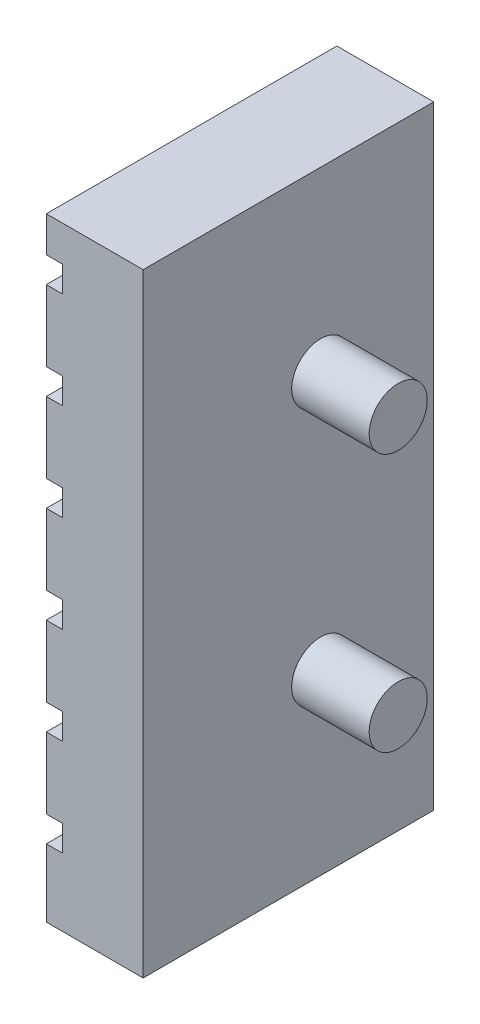
ISO-10303-21;
HEADER;
FILE_DESCRIPTION(('STEP AP214'),'2;1');
FILE_NAME('part.step','',(''),(''),'','','');
FILE_SCHEMA(('AUTOMOTIVE_DESIGN { 1 0 10303 214 1 1 1 1 }'));
ENDSEC;
DATA;
#1=APPLICATION_CONTEXT('core data for automotive mechanical design processes');
#2=APPLICATION_PROTOCOL_DEFINITION('international standard','automotive_design',2000,#1);
#3=PRODUCT_CONTEXT('',#1,'mechanical');
#4=PRODUCT('Part','Part','',(#3));
#5=PRODUCT_RELATED_PRODUCT_CATEGORY('part','',(#4));
#6=PRODUCT_DEFINITION_FORMATION('','',#4);
#7=PRODUCT_DEFINITION_CONTEXT('part definition',#1,'design');
#8=PRODUCT_DEFINITION('design','',#6,#7);
#9=PRODUCT_DEFINITION_SHAPE('','',#8);
#10=(LENGTH_UNIT() NAMED_UNIT(*) SI_UNIT(.MILLI.,.METRE.));
#11=(NAMED_UNIT(*) PLANE_ANGLE_UNIT() SI_UNIT($,.RADIAN.));
#12=(NAMED_UNIT(*) SI_UNIT($,.STERADIAN.) SOLID_ANGLE_UNIT());
#13=UNCERTAINTY_MEASURE_WITH_UNIT(LENGTH_MEASURE(1.E-05),#10,'distance_accuracy_value','');
#14=(GEOMETRIC_REPRESENTATION_CONTEXT(3) GLOBAL_UNCERTAINTY_ASSIGNED_CONTEXT((#13)) GLOBAL_UNIT_ASSIGNED_CONTEXT((#10,
#11,#12)) REPRESENTATION_CONTEXT('',''));
#15=CARTESIAN_POINT('',(0.,0.,0.));
#16=DIRECTION('',(0.,0.,1.));
#17=DIRECTION('',(1.,0.,0.));
#18=AXIS2_PLACEMENT_3D('',#15,#16,#17);
#19=CARTESIAN_POINT('',(-3.6,-52.,3.5));
#20=DIRECTION('',(1.,0.,0.));
#21=DIRECTION('',(0.,1.,0.));
#22=AXIS2_PLACEMENT_3D('',#19,#20,#21);
#23=PLANE('',#22);
#24=CARTESIAN_POINT('',(-3.6,-52.,3.5));
#25=DIRECTION('',(1.,0.,0.));
#26=DIRECTION('',(0.,0.,1.));
#27=AXIS2_PLACEMENT_3D('',#24,#25,#26);
#28=CIRCLE('',#27,0.9);
#29=CARTESIAN_POINT('',(-3.6,-52.,4.4));
#30=VERTEX_POINT('',#29);
#31=EDGE_CURVE('E194',#30,#30,#28,.T.);
#32=ORIENTED_EDGE('',*,*,#31,.T.);
#33=EDGE_LOOP('',(#32));
#34=FACE_BOUND('',#33,.T.);
#35=ADVANCED_FACE('F16',(#34),#23,.T.);
#36=CARTESIAN_POINT('',(-3.6,-60.,3.5));
#37=DIRECTION('',(1.,0.,0.));
#38=DIRECTION('',(0.,1.,0.));
#39=AXIS2_PLACEMENT_3D('',#36,#37,#38);
#40=PLANE('',#39);
#41=CARTESIAN_POINT('',(-3.6,-60.,3.5));
#42=DIRECTION('',(1.,0.,0.));
#43=DIRECTION('',(0.,0.,1.));
#44=AXIS2_PLACEMENT_3D('',#41,#42,#43);
#45=CIRCLE('',#44,0.9);
#46=CARTESIAN_POINT('',(-3.6,-60.,4.4));
#47=VERTEX_POINT('',#46);
#48=EDGE_CURVE('E195',#47,#47,#45,.T.);
#49=ORIENTED_EDGE('',*,*,#48,.T.);
#50=EDGE_LOOP('',(#49));
#51=FACE_BOUND('',#50,.T.);
#52=ADVANCED_FACE('F18',(#51),#40,.T.);
#53=CARTESIAN_POINT('',(-9.,-46.5,0.));
#54=DIRECTION('',(1.,0.,0.));
#55=DIRECTION('',(0.,1.,0.));
#56=AXIS2_PLACEMENT_3D('',#53,#54,#55);
#57=PLANE('',#56);
#58=DIRECTION('',(0.,0.,1.));
#59=VECTOR('',#58,1.);
#60=CARTESIAN_POINT('',(-9.,-47.6,-0.5));
#61=LINE('',#60,#59);
#62=CARTESIAN_POINT('',(-9.,-47.6,0.));
#63=VERTEX_POINT('',#62);
#64=CARTESIAN_POINT('',(-9.,-47.6,9.));
#65=VERTEX_POINT('',#64);
#66=EDGE_CURVE('E10',#63,#65,#61,.T.);
#67=ORIENTED_EDGE('',*,*,#66,.T.);
#68=DIRECTION('',(0.,-1.,0.));
#69=VECTOR('',#68,1.);
#70=CARTESIAN_POINT('',(-9.,-46.5,9.));
#71=LINE('',#70,#69);
#72=CARTESIAN_POINT('',(-9.,-46.5,9.));
#73=VERTEX_POINT('',#72);
#74=EDGE_CURVE('E281',#73,#65,#71,.T.);
#75=ORIENTED_EDGE('',*,*,#74,.F.);
#76=DIRECTION('',(0.,0.,1.));
#77=VECTOR('',#76,1.);
#78=CARTESIAN_POINT('',(-9.,-46.5,0.));
#79=LINE('',#78,#77);
#80=CARTESIAN_POINT('',(-9.,-46.5,0.));
#81=VERTEX_POINT('',#80);
#82=EDGE_CURVE('E199',#81,#73,#79,.T.);
#83=ORIENTED_EDGE('',*,*,#82,.F.);
#84=DIRECTION('',(0.,-1.,0.));
#85=VECTOR('',#84,1.);
#86=CARTESIAN_POINT('',(-9.,-46.5,0.));
#87=LINE('',#86,#85);
#88=EDGE_CURVE('E312',#81,#63,#87,.T.);
#89=ORIENTED_EDGE('',*,*,#88,.T.);
#90=EDGE_LOOP('',(#67,#75,#83,#89));
#91=FACE_BOUND('',#90,.T.);
#92=ADVANCED_FACE('F707',(#91),#57,.F.);
#93=CARTESIAN_POINT('',(-9.5,-47.6,-1.));
#94=DIRECTION('',(0.,1.,0.));
#95=DIRECTION('',(1.,0.,0.));
#96=AXIS2_PLACEMENT_3D('',#93,#94,#95);
#97=PLANE('',#96);
#98=DIRECTION('',(-1.,0.,0.));
#99=VECTOR('',#98,1.);
#100=CARTESIAN_POINT('',(-8.5,-47.6,9.));
#101=LINE('',#100,#99);
#102=CARTESIAN_POINT('',(-8.5,-47.6,9.));
#103=VERTEX_POINT('',#102);
#104=EDGE_CURVE('E279',#103,#65,#101,.T.);
#105=ORIENTED_EDGE('',*,*,#104,.T.);
#106=ORIENTED_EDGE('',*,*,#66,.F.);
#107=DIRECTION('',(-1.,0.,0.));
#108=VECTOR('',#107,1.);
#109=CARTESIAN_POINT('',(-8.5,-47.6,0.));
#110=LINE('',#109,#108);
#111=CARTESIAN_POINT('',(-8.5,-47.6,0.));
#112=VERTEX_POINT('',#111);
#113=EDGE_CURVE('E317',#112,#63,#110,.T.);
#114=ORIENTED_EDGE('',*,*,#113,.F.);
#115=DIRECTION('',(0.,0.,1.));
#116=VECTOR('',#115,1.);
#117=CARTESIAN_POINT('',(-8.5,-47.6,-1.));
#118=LINE('',#117,#116);
#119=EDGE_CURVE('E27',#112,#103,#118,.T.);
#120=ORIENTED_EDGE('',*,*,#119,.T.);
#121=EDGE_LOOP('',(#105,#106,#114,#120));
#122=FACE_BOUND('',#121,.T.);
#123=ADVANCED_FACE('F717',(#122),#97,.F.);
#124=CARTESIAN_POINT('',(-8.5,-48.4,-1.));
#125=DIRECTION('',(1.,0.,0.));
#126=DIRECTION('',(0.,1.,0.));
#127=AXIS2_PLACEMENT_3D('',#124,#125,#126);
#128=PLANE('',#127);
#129=DIRECTION('',(0.,1.,0.));
#130=VECTOR('',#129,1.);
#131=CARTESIAN_POINT('',(-8.5,-52.2,9.));
#132=LINE('',#131,#130);
#133=CARTESIAN_POINT('',(-8.5,-48.4,9.));
#134=VERTEX_POINT('',#133);
#135=EDGE_CURVE('E276',#134,#103,#132,.T.);
#136=ORIENTED_EDGE('',*,*,#135,.T.);
#137=ORIENTED_EDGE('',*,*,#119,.F.);
#138=DIRECTION('',(0.,1.,0.));
#139=VECTOR('',#138,1.);
#140=CARTESIAN_POINT('',(-8.5,-52.2,0.));
#141=LINE('',#140,#139);
#142=CARTESIAN_POINT('',(-8.5,-48.4,0.));
#143=VERTEX_POINT('',#142);
#144=EDGE_CURVE('E321',#143,#112,#141,.T.);
#145=ORIENTED_EDGE('',*,*,#144,.F.);
#146=DIRECTION('',(0.,0.,1.));
#147=VECTOR('',#146,1.);
#148=CARTESIAN_POINT('',(-8.5,-48.4,-1.));
#149=LINE('',#148,#147);
#150=EDGE_CURVE('E20',#143,#134,#149,.T.);
#151=ORIENTED_EDGE('',*,*,#150,.T.);
#152=EDGE_LOOP('',(#136,#137,#145,#151));
#153=FACE_BOUND('',#152,.T.);
#154=ADVANCED_FACE('F725',(#153),#128,.F.);
#155=CARTESIAN_POINT('',(-9.5,-48.4,-1.));
#156=DIRECTION('',(0.,1.,0.));
#157=DIRECTION('',(1.,0.,0.));
#158=AXIS2_PLACEMENT_3D('',#155,#156,#157);
#159=PLANE('',#158);
#160=ORIENTED_EDGE('',*,*,#150,.F.);
#161=DIRECTION('',(-1.,0.,0.));
#162=VECTOR('',#161,1.);
#163=CARTESIAN_POINT('',(-8.5,-48.4,0.));
#164=LINE('',#163,#162);
#165=CARTESIAN_POINT('',(-9.,-48.4,0.));
#166=VERTEX_POINT('',#165);
#167=EDGE_CURVE('E325',#143,#166,#164,.T.);
#168=ORIENTED_EDGE('',*,*,#167,.T.);
#169=DIRECTION('',(0.,0.,1.));
#170=VECTOR('',#169,1.);
#171=CARTESIAN_POINT('',(-9.,-48.4,-0.5));
#172=LINE('',#171,#170);
#173=CARTESIAN_POINT('',(-9.,-48.4,9.));
#174=VERTEX_POINT('',#173);
#175=EDGE_CURVE('E187',#166,#174,#172,.T.);
#176=ORIENTED_EDGE('',*,*,#175,.T.);
#177=DIRECTION('',(-1.,0.,0.));
#178=VECTOR('',#177,1.);
#179=CARTESIAN_POINT('',(-8.5,-48.4,9.));
#180=LINE('',#179,#178);
#181=EDGE_CURVE('E271',#134,#174,#180,.T.);
#182=ORIENTED_EDGE('',*,*,#181,.F.);
#183=EDGE_LOOP('',(#160,#168,#176,#182));
#184=FACE_BOUND('',#183,.T.);
#185=ADVANCED_FACE('F734',(#184),#159,.T.);
#186=CARTESIAN_POINT('',(-9.,-46.5,0.));
#187=DIRECTION('',(1.,0.,0.));
#188=DIRECTION('',(0.,1.,0.));
#189=AXIS2_PLACEMENT_3D('',#186,#187,#188);
#190=PLANE('',#189);
#191=DIRECTION('',(0.,0.,1.));
#192=VECTOR('',#191,1.);
#193=CARTESIAN_POINT('',(-9.,-50.6,-0.5));
#194=LINE('',#193,#192);
#195=CARTESIAN_POINT('',(-9.,-50.6,0.));
#196=VERTEX_POINT('',#195);
#197=CARTESIAN_POINT('',(-9.,-50.6,9.));
#198=VERTEX_POINT('',#197);
#199=EDGE_CURVE('E189',#196,#198,#194,.T.);
#200=ORIENTED_EDGE('',*,*,#199,.T.);
#201=DIRECTION('',(0.,-1.,0.));
#202=VECTOR('',#201,1.);
#203=CARTESIAN_POINT('',(-9.,-46.5,9.));
#204=LINE('',#203,#202);
#205=EDGE_CURVE('E253',#174,#198,#204,.T.);
#206=ORIENTED_EDGE('',*,*,#205,.F.);
#207=ORIENTED_EDGE('',*,*,#175,.F.);
#208=DIRECTION('',(0.,-1.,0.));
#209=VECTOR('',#208,1.);
#210=CARTESIAN_POINT('',(-9.,-46.5,0.));
#211=LINE('',#210,#209);
#212=EDGE_CURVE('E257',#166,#196,#211,.T.);
#213=ORIENTED_EDGE('',*,*,#212,.T.);
#214=EDGE_LOOP('',(#200,#206,#207,#213));
#215=FACE_BOUND('',#214,.T.);
#216=ADVANCED_FACE('F250',(#215),#190,.F.);
#217=CARTESIAN_POINT('',(-9.5,-50.6,-1.));
#218=DIRECTION('',(0.,1.,0.));
#219=DIRECTION('',(1.,0.,0.));
#220=AXIS2_PLACEMENT_3D('',#217,#218,#219);
#221=PLANE('',#220);
#222=DIRECTION('',(-1.,0.,0.));
#223=VECTOR('',#222,1.);
#224=CARTESIAN_POINT('',(-8.5,-50.6,9.));
#225=LINE('',#224,#223);
#226=CARTESIAN_POINT('',(-8.5,-50.6,9.));
#227=VERTEX_POINT('',#226);
#228=EDGE_CURVE('E262',#227,#198,#225,.T.);
#229=ORIENTED_EDGE('',*,*,#228,.T.);
#230=ORIENTED_EDGE('',*,*,#199,.F.);
#231=DIRECTION('',(-1.,0.,0.));
#232=VECTOR('',#231,1.);
#233=CARTESIAN_POINT('',(-8.5,-50.6,0.));
#234=LINE('',#233,#232);
#235=CARTESIAN_POINT('',(-8.5,-50.6,0.));
#236=VERTEX_POINT('',#235);
#237=EDGE_CURVE('E337',#236,#196,#234,.T.);
#238=ORIENTED_EDGE('',*,*,#237,.F.);
#239=DIRECTION('',(0.,0.,1.));
#240=VECTOR('',#239,1.);
#241=CARTESIAN_POINT('',(-8.5,-50.6,-1.));
#242=LINE('',#241,#240);
#243=EDGE_CURVE('E209',#236,#227,#242,.T.);
#244=ORIENTED_EDGE('',*,*,#243,.T.);
#245=EDGE_LOOP('',(#229,#230,#238,#244));
#246=FACE_BOUND('',#245,.T.);
#247=ADVANCED_FACE('F263',(#246),#221,.F.);
#248=CARTESIAN_POINT('',(-8.5,-51.4,-1.));
#249=DIRECTION('',(1.,0.,0.));
#250=DIRECTION('',(0.,1.,0.));
#251=AXIS2_PLACEMENT_3D('',#248,#249,#250);
#252=PLANE('',#251);
#253=DIRECTION('',(0.,1.,0.));
#254=VECTOR('',#253,1.);
#255=CARTESIAN_POINT('',(-8.5,-53.7,9.));
#256=LINE('',#255,#254);
#257=CARTESIAN_POINT('',(-8.5,-51.4,9.));
#258=VERTEX_POINT('',#257);
#259=EDGE_CURVE('E155',#258,#227,#256,.T.);
#260=ORIENTED_EDGE('',*,*,#259,.T.);
#261=ORIENTED_EDGE('',*,*,#243,.F.);
#262=DIRECTION('',(0.,1.,0.));
#263=VECTOR('',#262,1.);
#264=CARTESIAN_POINT('',(-8.5,-53.7,0.));
#265=LINE('',#264,#263);
#266=CARTESIAN_POINT('',(-8.5,-51.4,0.));
#267=VERTEX_POINT('',#266);
#268=EDGE_CURVE('E340',#267,#236,#265,.T.);
#269=ORIENTED_EDGE('',*,*,#268,.F.);
#270=DIRECTION('',(0.,0.,1.));
#271=VECTOR('',#270,1.);
#272=CARTESIAN_POINT('',(-8.5,-51.4,-1.));
#273=LINE('',#272,#271);
#274=EDGE_CURVE('E212',#267,#258,#273,.T.);
#275=ORIENTED_EDGE('',*,*,#274,.T.);
#276=EDGE_LOOP('',(#260,#261,#269,#275));
#277=FACE_BOUND('',#276,.T.);
#278=ADVANCED_FACE('F762',(#277),#252,.F.);
#279=CARTESIAN_POINT('',(-9.5,-51.4,-1.));
#280=DIRECTION('',(0.,1.,0.));
#281=DIRECTION('',(1.,0.,0.));
#282=AXIS2_PLACEMENT_3D('',#279,#280,#281);
#283=PLANE('',#282);
#284=ORIENTED_EDGE('',*,*,#274,.F.);
#285=DIRECTION('',(-1.,0.,0.));
#286=VECTOR('',#285,1.);
#287=CARTESIAN_POINT('',(-8.5,-51.4,0.));
#288=LINE('',#287,#286);
#289=CARTESIAN_POINT('',(-9.,-51.4,0.));
#290=VERTEX_POINT('',#289);
#291=EDGE_CURVE('E347',#267,#290,#288,.T.);
#292=ORIENTED_EDGE('',*,*,#291,.T.);
#293=DIRECTION('',(0.,0.,1.));
#294=VECTOR('',#293,1.);
#295=CARTESIAN_POINT('',(-9.,-51.4,-0.5));
#296=LINE('',#295,#294);
#297=CARTESIAN_POINT('',(-9.,-51.4,9.));
#298=VERTEX_POINT('',#297);
#299=EDGE_CURVE('E237',#290,#298,#296,.T.);
#300=ORIENTED_EDGE('',*,*,#299,.T.);
#301=DIRECTION('',(-1.,0.,0.));
#302=VECTOR('',#301,1.);
#303=CARTESIAN_POINT('',(-8.5,-51.4,9.));
#304=LINE('',#303,#302);
#305=EDGE_CURVE('E157',#258,#298,#304,.T.);
#306=ORIENTED_EDGE('',*,*,#305,.F.);
#307=EDGE_LOOP('',(#284,#292,#300,#306));
#308=FACE_BOUND('',#307,.T.);
#309=ADVANCED_FACE('F767',(#308),#283,.T.);
#310=CARTESIAN_POINT('',(-9.,-46.5,0.));
#311=DIRECTION('',(1.,0.,0.));
#312=DIRECTION('',(0.,1.,0.));
#313=AXIS2_PLACEMENT_3D('',#310,#311,#312);
#314=PLANE('',#313);
#315=DIRECTION('',(0.,0.,1.));
#316=VECTOR('',#315,1.);
#317=CARTESIAN_POINT('',(-9.,-53.6,-0.5));
#318=LINE('',#317,#316);
#319=CARTESIAN_POINT('',(-9.,-53.6,0.));
#320=VERTEX_POINT('',#319);
#321=CARTESIAN_POINT('',(-9.,-53.6,9.));
#322=VERTEX_POINT('',#321);
#323=EDGE_CURVE('E233',#320,#322,#318,.T.);
#324=ORIENTED_EDGE('',*,*,#323,.T.);
#325=DIRECTION('',(0.,-1.,0.));
#326=VECTOR('',#325,1.);
#327=CARTESIAN_POINT('',(-9.,-46.5,9.));
#328=LINE('',#327,#326);
#329=EDGE_CURVE('E160',#298,#322,#328,.T.);
#330=ORIENTED_EDGE('',*,*,#329,.F.);
#331=ORIENTED_EDGE('',*,*,#299,.F.);
#332=DIRECTION('',(0.,-1.,0.));
#333=VECTOR('',#332,1.);
#334=CARTESIAN_POINT('',(-9.,-46.5,0.));
#335=LINE('',#334,#333);
#336=EDGE_CURVE('E351',#290,#320,#335,.T.);
#337=ORIENTED_EDGE('',*,*,#336,.T.);
#338=EDGE_LOOP('',(#324,#330,#331,#337));
#339=FACE_BOUND('',#338,.T.);
#340=ADVANCED_FACE('F486',(#339),#314,.F.);
#341=CARTESIAN_POINT('',(-9.5,-53.6,-1.));
#342=DIRECTION('',(0.,1.,0.));
#343=DIRECTION('',(1.,0.,0.));
#344=AXIS2_PLACEMENT_3D('',#341,#342,#343);
#345=PLANE('',#344);
#346=DIRECTION('',(-1.,0.,0.));
#347=VECTOR('',#346,1.);
#348=CARTESIAN_POINT('',(-8.5,-53.6,9.));
#349=LINE('',#348,#347);
#350=CARTESIAN_POINT('',(-8.5,-53.6,9.));
#351=VERTEX_POINT('',#350);
#352=EDGE_CURVE('E161',#351,#322,#349,.T.);
#353=ORIENTED_EDGE('',*,*,#352,.T.);
#354=ORIENTED_EDGE('',*,*,#323,.F.);
#355=DIRECTION('',(-1.,0.,0.));
#356=VECTOR('',#355,1.);
#357=CARTESIAN_POINT('',(-8.5,-53.6,0.));
#358=LINE('',#357,#356);
#359=CARTESIAN_POINT('',(-8.5,-53.6,0.));
#360=VERTEX_POINT('',#359);
#361=EDGE_CURVE('E355',#360,#320,#358,.T.);
#362=ORIENTED_EDGE('',*,*,#361,.F.);
#363=DIRECTION('',(0.,0.,1.));
#364=VECTOR('',#363,1.);
#365=CARTESIAN_POINT('',(-8.5,-53.6,-1.));
#366=LINE('',#365,#364);
#367=EDGE_CURVE('E226',#360,#351,#366,.T.);
#368=ORIENTED_EDGE('',*,*,#367,.T.);
#369=EDGE_LOOP('',(#353,#354,#362,#368));
#370=FACE_BOUND('',#369,.T.);
#371=ADVANCED_FACE('F493',(#370),#345,.F.);
#372=CARTESIAN_POINT('',(-8.5,-54.4,-1.));
#373=DIRECTION('',(1.,0.,0.));
#374=DIRECTION('',(0.,1.,0.));
#375=AXIS2_PLACEMENT_3D('',#372,#373,#374);
#376=PLANE('',#375);
#377=DIRECTION('',(0.,1.,0.));
#378=VECTOR('',#377,1.);
#379=CARTESIAN_POINT('',(-8.5,-55.2,9.));
#380=LINE('',#379,#378);
#381=CARTESIAN_POINT('',(-8.5,-54.4,9.));
#382=VERTEX_POINT('',#381);
#383=EDGE_CURVE('E165',#382,#351,#380,.T.);
#384=ORIENTED_EDGE('',*,*,#383,.T.);
#385=ORIENTED_EDGE('',*,*,#367,.F.);
#386=DIRECTION('',(0.,1.,0.));
#387=VECTOR('',#386,1.);
#388=CARTESIAN_POINT('',(-8.5,-55.2,0.));
#389=LINE('',#388,#387);
#390=CARTESIAN_POINT('',(-8.5,-54.4,0.));
#391=VERTEX_POINT('',#390);
#392=EDGE_CURVE('E359',#391,#360,#389,.T.);
#393=ORIENTED_EDGE('',*,*,#392,.F.);
#394=DIRECTION('',(0.,0.,1.));
#395=VECTOR('',#394,1.);
#396=CARTESIAN_POINT('',(-8.5,-54.4,-1.));
#397=LINE('',#396,#395);
#398=EDGE_CURVE('E223',#391,#382,#397,.T.);
#399=ORIENTED_EDGE('',*,*,#398,.T.);
#400=EDGE_LOOP('',(#384,#385,#393,#399));
#401=FACE_BOUND('',#400,.T.);
#402=ADVANCED_FACE('F500',(#401),#376,.F.);
#403=CARTESIAN_POINT('',(-9.5,-54.4,-1.));
#404=DIRECTION('',(0.,1.,0.));
#405=DIRECTION('',(1.,0.,0.));
#406=AXIS2_PLACEMENT_3D('',#403,#404,#405);
#407=PLANE('',#406);
#408=ORIENTED_EDGE('',*,*,#398,.F.);
#409=DIRECTION('',(-1.,0.,0.));
#410=VECTOR('',#409,1.);
#411=CARTESIAN_POINT('',(-8.5,-54.4,0.));
#412=LINE('',#411,#410);
#413=CARTESIAN_POINT('',(-9.,-54.4,0.));
#414=VERTEX_POINT('',#413);
#415=EDGE_CURVE('E363',#391,#414,#412,.T.);
#416=ORIENTED_EDGE('',*,*,#415,.T.);
#417=DIRECTION('',(0.,0.,1.));
#418=VECTOR('',#417,1.);
#419=CARTESIAN_POINT('',(-9.,-54.4,-0.5));
#420=LINE('',#419,#418);
#421=CARTESIAN_POINT('',(-9.,-54.4,9.));
#422=VERTEX_POINT('',#421);
#423=EDGE_CURVE('E227',#414,#422,#420,.T.);
#424=ORIENTED_EDGE('',*,*,#423,.T.);
#425=DIRECTION('',(-1.,0.,0.));
#426=VECTOR('',#425,1.);
#427=CARTESIAN_POINT('',(-8.5,-54.4,9.));
#428=LINE('',#427,#426);
#429=EDGE_CURVE('E169',#382,#422,#428,.T.);
#430=ORIENTED_EDGE('',*,*,#429,.F.);
#431=EDGE_LOOP('',(#408,#416,#424,#430));
#432=FACE_BOUND('',#431,.T.);
#433=ADVANCED_FACE('F508',(#432),#407,.T.);
#434=CARTESIAN_POINT('',(-9.,-46.5,0.));
#435=DIRECTION('',(1.,0.,0.));
#436=DIRECTION('',(0.,1.,0.));
#437=AXIS2_PLACEMENT_3D('',#434,#435,#436);
#438=PLANE('',#437);
#439=DIRECTION('',(0.,0.,1.));
#440=VECTOR('',#439,1.);
#441=CARTESIAN_POINT('',(-9.,-56.6,-0.5));
#442=LINE('',#441,#440);
#443=CARTESIAN_POINT('',(-9.,-56.6,0.));
#444=VERTEX_POINT('',#443);
#445=CARTESIAN_POINT('',(-9.,-56.6,9.));
#446=VERTEX_POINT('',#445);
#447=EDGE_CURVE('E299',#444,#446,#442,.T.);
#448=ORIENTED_EDGE('',*,*,#447,.T.);
#449=DIRECTION('',(0.,-1.,0.));
#450=VECTOR('',#449,1.);
#451=CARTESIAN_POINT('',(-9.,-46.5,9.));
#452=LINE('',#451,#450);
#453=EDGE_CURVE('E173',#422,#446,#452,.T.);
#454=ORIENTED_EDGE('',*,*,#453,.F.);
#455=ORIENTED_EDGE('',*,*,#423,.F.);
#456=DIRECTION('',(0.,-1.,0.));
#457=VECTOR('',#456,1.);
#458=CARTESIAN_POINT('',(-9.,-46.5,0.));
#459=LINE('',#458,#457);
#460=EDGE_CURVE('E370',#414,#444,#459,.T.);
#461=ORIENTED_EDGE('',*,*,#460,.T.);
#462=EDGE_LOOP('',(#448,#454,#455,#461));
#463=FACE_BOUND('',#462,.T.);
#464=ADVANCED_FACE('F515',(#463),#438,.F.);
#465=CARTESIAN_POINT('',(-9.5,-56.6,-1.));
#466=DIRECTION('',(0.,1.,0.));
#467=DIRECTION('',(1.,0.,0.));
#468=AXIS2_PLACEMENT_3D('',#465,#466,#467);
#469=PLANE('',#468);
#470=DIRECTION('',(-1.,0.,0.));
#471=VECTOR('',#470,1.);
#472=CARTESIAN_POINT('',(-8.5,-56.6,9.));
#473=LINE('',#472,#471);
#474=CARTESIAN_POINT('',(-8.5,-56.6,9.));
#475=VERTEX_POINT('',#474);
#476=EDGE_CURVE('E313',#475,#446,#473,.T.);
#477=ORIENTED_EDGE('',*,*,#476,.T.);
#478=ORIENTED_EDGE('',*,*,#447,.F.);
#479=DIRECTION('',(-1.,0.,0.));
#480=VECTOR('',#479,1.);
#481=CARTESIAN_POINT('',(-8.5,-56.6,0.));
#482=LINE('',#481,#480);
#483=CARTESIAN_POINT('',(-8.5,-56.6,0.));
#484=VERTEX_POINT('',#483);
#485=EDGE_CURVE('E374',#484,#444,#482,.T.);
#486=ORIENTED_EDGE('',*,*,#485,.F.);
#487=DIRECTION('',(0.,0.,1.));
#488=VECTOR('',#487,1.);
#489=CARTESIAN_POINT('',(-8.5,-56.6,-1.));
#490=LINE('',#489,#488);
#491=EDGE_CURVE('E221',#484,#475,#490,.T.);
#492=ORIENTED_EDGE('',*,*,#491,.T.);
#493=EDGE_LOOP('',(#477,#478,#486,#492));
#494=FACE_BOUND('',#493,.T.);
#495=ADVANCED_FACE('F520',(#494),#469,.F.);
#496=CARTESIAN_POINT('',(-8.5,-57.4,-1.));
#497=DIRECTION('',(1.,0.,0.));
#498=DIRECTION('',(0.,1.,0.));
#499=AXIS2_PLACEMENT_3D('',#496,#497,#498);
#500=PLANE('',#499);
#501=DIRECTION('',(0.,1.,0.));
#502=VECTOR('',#501,1.);
#503=CARTESIAN_POINT('',(-8.5,-56.7,9.));
#504=LINE('',#503,#502);
#505=CARTESIAN_POINT('',(-8.5,-57.4,9.));
#506=VERTEX_POINT('',#505);
#507=EDGE_CURVE('E179',#506,#475,#504,.T.);
#508=ORIENTED_EDGE('',*,*,#507,.T.);
#509=ORIENTED_EDGE('',*,*,#491,.F.);
#510=DIRECTION('',(0.,1.,0.));
#511=VECTOR('',#510,1.);
#512=CARTESIAN_POINT('',(-8.5,-56.7,0.));
#513=LINE('',#512,#511);
#514=CARTESIAN_POINT('',(-8.5,-57.4,0.));
#515=VERTEX_POINT('',#514);
#516=EDGE_CURVE('E378',#515,#484,#513,.T.);
#517=ORIENTED_EDGE('',*,*,#516,.F.);
#518=DIRECTION('',(0.,0.,1.));
#519=VECTOR('',#518,1.);
#520=CARTESIAN_POINT('',(-8.5,-57.4,-1.));
#521=LINE('',#520,#519);
#522=EDGE_CURVE('E218',#515,#506,#521,.T.);
#523=ORIENTED_EDGE('',*,*,#522,.T.);
#524=EDGE_LOOP('',(#508,#509,#517,#523));
#525=FACE_BOUND('',#524,.T.);
#526=ADVANCED_FACE('F525',(#525),#500,.F.);
#527=CARTESIAN_POINT('',(-9.5,-57.4,-1.));
#528=DIRECTION('',(0.,1.,0.));
#529=DIRECTION('',(1.,0.,0.));
#530=AXIS2_PLACEMENT_3D('',#527,#528,#529);
#531=PLANE('',#530);
#532=ORIENTED_EDGE('',*,*,#522,.F.);
#533=DIRECTION('',(-1.,0.,0.));
#534=VECTOR('',#533,1.);
#535=CARTESIAN_POINT('',(-8.5,-57.4,0.));
#536=LINE('',#535,#534);
#537=CARTESIAN_POINT('',(-9.,-57.4,0.));
#538=VERTEX_POINT('',#537);
#539=EDGE_CURVE('E382',#515,#538,#536,.T.);
#540=ORIENTED_EDGE('',*,*,#539,.T.);
#541=DIRECTION('',(0.,0.,1.));
#542=VECTOR('',#541,1.);
#543=CARTESIAN_POINT('',(-9.,-57.4,-0.5));
#544=LINE('',#543,#542);
#545=CARTESIAN_POINT('',(-9.,-57.4,9.));
#546=VERTEX_POINT('',#545);
#547=EDGE_CURVE('E222',#538,#546,#544,.T.);
#548=ORIENTED_EDGE('',*,*,#547,.T.);
#549=DIRECTION('',(-1.,0.,0.));
#550=VECTOR('',#549,1.);
#551=CARTESIAN_POINT('',(-8.5,-57.4,9.));
#552=LINE('',#551,#550);
#553=EDGE_CURVE('E174',#506,#546,#552,.T.);
#554=ORIENTED_EDGE('',*,*,#553,.F.);
#555=EDGE_LOOP('',(#532,#540,#548,#554));
#556=FACE_BOUND('',#555,.T.);
#557=ADVANCED_FACE('F532',(#556),#531,.T.);
#558=CARTESIAN_POINT('',(-9.,-46.5,0.));
#559=DIRECTION('',(1.,0.,0.));
#560=DIRECTION('',(0.,1.,0.));
#561=AXIS2_PLACEMENT_3D('',#558,#559,#560);
#562=PLANE('',#561);
#563=DIRECTION('',(0.,0.,1.));
#564=VECTOR('',#563,1.);
#565=CARTESIAN_POINT('',(-9.,-59.6,-0.5));
#566=LINE('',#565,#564);
#567=CARTESIAN_POINT('',(-9.,-59.6,0.));
#568=VERTEX_POINT('',#567);
#569=CARTESIAN_POINT('',(-9.,-59.6,9.));
#570=VERTEX_POINT('',#569);
#571=EDGE_CURVE('E386',#568,#570,#566,.T.);
#572=ORIENTED_EDGE('',*,*,#571,.T.);
#573=DIRECTION('',(0.,-1.,0.));
#574=VECTOR('',#573,1.);
#575=CARTESIAN_POINT('',(-9.,-46.5,9.));
#576=LINE('',#575,#574);
#577=EDGE_CURVE('E178',#546,#570,#576,.T.);
#578=ORIENTED_EDGE('',*,*,#577,.F.);
#579=ORIENTED_EDGE('',*,*,#547,.F.);
#580=DIRECTION('',(0.,-1.,0.));
#581=VECTOR('',#580,1.);
#582=CARTESIAN_POINT('',(-9.,-46.5,0.));
#583=LINE('',#582,#581);
#584=EDGE_CURVE('E390',#538,#568,#583,.T.);
#585=ORIENTED_EDGE('',*,*,#584,.T.);
#586=EDGE_LOOP('',(#572,#578,#579,#585));
#587=FACE_BOUND('',#586,.T.);
#588=ADVANCED_FACE('F538',(#587),#562,.F.);
#589=CARTESIAN_POINT('',(-9.5,-59.6,-1.));
#590=DIRECTION('',(0.,1.,0.));
#591=DIRECTION('',(1.,0.,0.));
#592=AXIS2_PLACEMENT_3D('',#589,#590,#591);
#593=PLANE('',#592);
#594=DIRECTION('',(-1.,0.,0.));
#595=VECTOR('',#594,1.);
#596=CARTESIAN_POINT('',(-8.5,-59.6,9.));
#597=LINE('',#596,#595);
#598=CARTESIAN_POINT('',(-8.5,-59.6,9.));
#599=VERTEX_POINT('',#598);
#600=EDGE_CURVE('E180',#599,#570,#597,.T.);
#601=ORIENTED_EDGE('',*,*,#600,.T.);
#602=ORIENTED_EDGE('',*,*,#571,.F.);
#603=DIRECTION('',(-1.,0.,0.));
#604=VECTOR('',#603,1.);
#605=CARTESIAN_POINT('',(-8.5,-59.6,0.));
#606=LINE('',#605,#604);
#607=CARTESIAN_POINT('',(-8.5,-59.6,0.));
#608=VERTEX_POINT('',#607);
#609=EDGE_CURVE('E396',#608,#568,#606,.T.);
#610=ORIENTED_EDGE('',*,*,#609,.F.);
#611=DIRECTION('',(0.,0.,1.));
#612=VECTOR('',#611,1.);
#613=CARTESIAN_POINT('',(-8.5,-59.6,-1.));
#614=LINE('',#613,#612);
#615=EDGE_CURVE('E217',#608,#599,#614,.T.);
#616=ORIENTED_EDGE('',*,*,#615,.T.);
#617=EDGE_LOOP('',(#601,#602,#610,#616));
#618=FACE_BOUND('',#617,.T.);
#619=ADVANCED_FACE('F544',(#618),#593,.F.);
#620=CARTESIAN_POINT('',(-8.5,-60.4,-1.));
#621=DIRECTION('',(1.,0.,0.));
#622=DIRECTION('',(0.,1.,0.));
#623=AXIS2_PLACEMENT_3D('',#620,#621,#622);
#624=PLANE('',#623);
#625=DIRECTION('',(0.,1.,0.));
#626=VECTOR('',#625,1.);
#627=CARTESIAN_POINT('',(-8.5,-58.2,9.));
#628=LINE('',#627,#626);
#629=CARTESIAN_POINT('',(-8.5,-60.4,9.));
#630=VERTEX_POINT('',#629);
#631=EDGE_CURVE('E151',#630,#599,#628,.T.);
#632=ORIENTED_EDGE('',*,*,#631,.T.);
#633=ORIENTED_EDGE('',*,*,#615,.F.);
#634=DIRECTION('',(0.,1.,0.));
#635=VECTOR('',#634,1.);
#636=CARTESIAN_POINT('',(-8.5,-58.2,0.));
#637=LINE('',#636,#635);
#638=CARTESIAN_POINT('',(-8.5,-60.4,0.));
#639=VERTEX_POINT('',#638);
#640=EDGE_CURVE('E403',#639,#608,#637,.T.);
#641=ORIENTED_EDGE('',*,*,#640,.F.);
#642=DIRECTION('',(0.,0.,1.));
#643=VECTOR('',#642,1.);
#644=CARTESIAN_POINT('',(-8.5,-60.4,-1.));
#645=LINE('',#644,#643);
#646=EDGE_CURVE('E213',#639,#630,#645,.T.);
#647=ORIENTED_EDGE('',*,*,#646,.T.);
#648=EDGE_LOOP('',(#632,#633,#641,#647));
#649=FACE_BOUND('',#648,.T.);
#650=ADVANCED_FACE('F551',(#649),#624,.F.);
#651=CARTESIAN_POINT('',(-9.5,-60.4,-1.));
#652=DIRECTION('',(0.,1.,0.));
#653=DIRECTION('',(1.,0.,0.));
#654=AXIS2_PLACEMENT_3D('',#651,#652,#653);
#655=PLANE('',#654);
#656=ORIENTED_EDGE('',*,*,#646,.F.);
#657=DIRECTION('',(-1.,0.,0.));
#658=VECTOR('',#657,1.);
#659=CARTESIAN_POINT('',(-8.5,-60.4,0.));
#660=LINE('',#659,#658);
#661=CARTESIAN_POINT('',(-9.,-60.4,0.));
#662=VERTEX_POINT('',#661);
#663=EDGE_CURVE('E407',#639,#662,#660,.T.);
#664=ORIENTED_EDGE('',*,*,#663,.T.);
#665=DIRECTION('',(0.,0.,1.));
#666=VECTOR('',#665,1.);
#667=CARTESIAN_POINT('',(-9.,-60.4,-0.5));
#668=LINE('',#667,#666);
#669=CARTESIAN_POINT('',(-9.,-60.4,9.));
#670=VERTEX_POINT('',#669);
#671=EDGE_CURVE('E126',#662,#670,#668,.T.);
#672=ORIENTED_EDGE('',*,*,#671,.T.);
#673=DIRECTION('',(-1.,0.,0.));
#674=VECTOR('',#673,1.);
#675=CARTESIAN_POINT('',(-8.5,-60.4,9.));
#676=LINE('',#675,#674);
#677=EDGE_CURVE('E144',#630,#670,#676,.T.);
#678=ORIENTED_EDGE('',*,*,#677,.F.);
#679=EDGE_LOOP('',(#656,#664,#672,#678));
#680=FACE_BOUND('',#679,.T.);
#681=ADVANCED_FACE('F558',(#680),#655,.T.);
#682=CARTESIAN_POINT('',(-9.,-46.5,0.));
#683=DIRECTION('',(1.,0.,0.));
#684=DIRECTION('',(0.,1.,0.));
#685=AXIS2_PLACEMENT_3D('',#682,#683,#684);
#686=PLANE('',#685);
#687=DIRECTION('',(0.,0.,1.));
#688=VECTOR('',#687,1.);
#689=CARTESIAN_POINT('',(-9.,-62.6,-0.5));
#690=LINE('',#689,#688);
#691=CARTESIAN_POINT('',(-9.,-62.6,0.));
#692=VERTEX_POINT('',#691);
#693=CARTESIAN_POINT('',(-9.,-62.6,9.));
#694=VERTEX_POINT('',#693);
#695=EDGE_CURVE('E112',#692,#694,#690,.T.);
#696=ORIENTED_EDGE('',*,*,#695,.T.);
#697=DIRECTION('',(0.,-1.,0.));
#698=VECTOR('',#697,1.);
#699=CARTESIAN_POINT('',(-9.,-46.5,9.));
#700=LINE('',#699,#698);
#701=EDGE_CURVE('E117',#670,#694,#700,.T.);
#702=ORIENTED_EDGE('',*,*,#701,.F.);
#703=ORIENTED_EDGE('',*,*,#671,.F.);
#704=DIRECTION('',(0.,-1.,0.));
#705=VECTOR('',#704,1.);
#706=CARTESIAN_POINT('',(-9.,-46.5,0.));
#707=LINE('',#706,#705);
#708=EDGE_CURVE('E121',#662,#692,#707,.T.);
#709=ORIENTED_EDGE('',*,*,#708,.T.);
#710=EDGE_LOOP('',(#696,#702,#703,#709));
#711=FACE_BOUND('',#710,.T.);
#712=ADVANCED_FACE('F114',(#711),#686,.F.);
#713=CARTESIAN_POINT('',(-9.5,-62.6,-1.));
#714=DIRECTION('',(0.,1.,0.));
#715=DIRECTION('',(1.,0.,0.));
#716=AXIS2_PLACEMENT_3D('',#713,#714,#715);
#717=PLANE('',#716);
#718=DIRECTION('',(-1.,0.,0.));
#719=VECTOR('',#718,1.);
#720=CARTESIAN_POINT('',(-8.5,-62.6,9.));
#721=LINE('',#720,#719);
#722=CARTESIAN_POINT('',(-8.5,-62.6,9.));
#723=VERTEX_POINT('',#722);
#724=EDGE_CURVE('E131',#723,#694,#721,.T.);
#725=ORIENTED_EDGE('',*,*,#724,.T.);
#726=ORIENTED_EDGE('',*,*,#695,.F.);
#727=DIRECTION('',(-1.,0.,0.));
#728=VECTOR('',#727,1.);
#729=CARTESIAN_POINT('',(-8.5,-62.6,0.));
#730=LINE('',#729,#728);
#731=CARTESIAN_POINT('',(-8.5,-62.6,0.));
#732=VERTEX_POINT('',#731);
#733=EDGE_CURVE('E412',#732,#692,#730,.T.);
#734=ORIENTED_EDGE('',*,*,#733,.F.);
#735=DIRECTION('',(0.,0.,1.));
#736=VECTOR('',#735,1.);
#737=CARTESIAN_POINT('',(-8.5,-62.6,-1.));
#738=LINE('',#737,#736);
#739=EDGE_CURVE('E127',#732,#723,#738,.T.);
#740=ORIENTED_EDGE('',*,*,#739,.T.);
#741=EDGE_LOOP('',(#725,#726,#734,#740));
#742=FACE_BOUND('',#741,.T.);
#743=ADVANCED_FACE('F132',(#742),#717,.F.);
#744=CARTESIAN_POINT('',(-8.5,-63.4,-1.));
#745=DIRECTION('',(1.,0.,0.));
#746=DIRECTION('',(0.,1.,0.));
#747=AXIS2_PLACEMENT_3D('',#744,#745,#746);
#748=PLANE('',#747);
#749=DIRECTION('',(0.,1.,0.));
#750=VECTOR('',#749,1.);
#751=CARTESIAN_POINT('',(-8.5,-59.7,9.));
#752=LINE('',#751,#750);
#753=CARTESIAN_POINT('',(-8.5,-63.4,9.));
#754=VERTEX_POINT('',#753);
#755=EDGE_CURVE('E295',#754,#723,#752,.T.);
#756=ORIENTED_EDGE('',*,*,#755,.T.);
#757=ORIENTED_EDGE('',*,*,#739,.F.);
#758=DIRECTION('',(0.,1.,0.));
#759=VECTOR('',#758,1.);
#760=CARTESIAN_POINT('',(-8.5,-59.7,0.));
#761=LINE('',#760,#759);
#762=CARTESIAN_POINT('',(-8.5,-63.4,0.));
#763=VERTEX_POINT('',#762);
#764=EDGE_CURVE('E300',#763,#732,#761,.T.);
#765=ORIENTED_EDGE('',*,*,#764,.F.);
#766=DIRECTION('',(0.,0.,1.));
#767=VECTOR('',#766,1.);
#768=CARTESIAN_POINT('',(-8.5,-63.4,-1.));
#769=LINE('',#768,#767);
#770=EDGE_CURVE('E139',#763,#754,#769,.T.);
#771=ORIENTED_EDGE('',*,*,#770,.T.);
#772=EDGE_LOOP('',(#756,#757,#765,#771));
#773=FACE_BOUND('',#772,.T.);
#774=ADVANCED_FACE('F897',(#773),#748,.F.);
#775=CARTESIAN_POINT('',(-6.,-52.,3.5));
#776=DIRECTION('',(1.,0.,0.));
#777=DIRECTION('',(0.,0.,1.));
#778=AXIS2_PLACEMENT_3D('',#775,#776,#777);
#779=CYLINDRICAL_SURFACE('',#778,0.9);
#780=ORIENTED_EDGE('',*,*,#31,.F.);
#781=DIRECTION('',(1.,0.,0.));
#782=VECTOR('',#781,1.);
#783=CARTESIAN_POINT('',(-6.,-52.,4.4));
#784=LINE('',#783,#782);
#785=CARTESIAN_POINT('',(-6.,-52.,4.4));
#786=VERTEX_POINT('',#785);
#787=EDGE_CURVE('E40',#786,#30,#784,.T.);
#788=ORIENTED_EDGE('',*,*,#787,.F.);
#789=CARTESIAN_POINT('',(-6.,-52.,3.5));
#790=DIRECTION('',(1.,0.,0.));
#791=DIRECTION('',(0.,0.,1.));
#792=AXIS2_PLACEMENT_3D('',#789,#790,#791);
#793=CIRCLE('',#792,0.9);
#794=EDGE_CURVE('E415',#786,#786,#793,.T.);
#795=ORIENTED_EDGE('',*,*,#794,.T.);
#796=ORIENTED_EDGE('',*,*,#787,.T.);
#797=EDGE_LOOP('',(#780,#788,#795,#796));
#798=FACE_BOUND('',#797,.T.);
#799=ADVANCED_FACE('F912',(#798),#779,.T.);
#800=CARTESIAN_POINT('',(-6.,-60.,3.5));
#801=DIRECTION('',(1.,0.,0.));
#802=DIRECTION('',(0.,0.,1.));
#803=AXIS2_PLACEMENT_3D('',#800,#801,#802);
#804=CYLINDRICAL_SURFACE('',#803,0.9);
#805=ORIENTED_EDGE('',*,*,#48,.F.);
#806=DIRECTION('',(1.,0.,0.));
#807=VECTOR('',#806,1.);
#808=CARTESIAN_POINT('',(-6.,-60.,4.4));
#809=LINE('',#808,#807);
#810=CARTESIAN_POINT('',(-6.,-60.,4.4));
#811=VERTEX_POINT('',#810);
#812=EDGE_CURVE('E191',#811,#47,#809,.T.);
#813=ORIENTED_EDGE('',*,*,#812,.F.);
#814=CARTESIAN_POINT('',(-6.,-60.,3.5));
#815=DIRECTION('',(1.,0.,0.));
#816=DIRECTION('',(0.,0.,1.));
#817=AXIS2_PLACEMENT_3D('',#814,#815,#816);
#818=CIRCLE('',#817,0.9);
#819=EDGE_CURVE('E418',#811,#811,#818,.T.);
#820=ORIENTED_EDGE('',*,*,#819,.T.);
#821=ORIENTED_EDGE('',*,*,#812,.T.);
#822=EDGE_LOOP('',(#805,#813,#820,#821));
#823=FACE_BOUND('',#822,.T.);
#824=ADVANCED_FACE('F889',(#823),#804,.T.);
#825=CARTESIAN_POINT('',(-6.,-46.5,0.));
#826=DIRECTION('',(0.,-1.,0.));
#827=DIRECTION('',(0.,0.,-1.));
#828=AXIS2_PLACEMENT_3D('',#825,#826,#827);
#829=PLANE('',#828);
#830=DIRECTION('',(-1.,0.,0.));
#831=VECTOR('',#830,1.);
#832=CARTESIAN_POINT('',(-6.,-46.5,0.));
#833=LINE('',#832,#831);
#834=CARTESIAN_POINT('',(-6.,-46.5,0.));
#835=VERTEX_POINT('',#834);
#836=EDGE_CURVE('E307',#835,#81,#833,.T.);
#837=ORIENTED_EDGE('',*,*,#836,.T.);
#838=ORIENTED_EDGE('',*,*,#82,.T.);
#839=DIRECTION('',(-1.,0.,0.));
#840=VECTOR('',#839,1.);
#841=CARTESIAN_POINT('',(-6.,-46.5,9.));
#842=LINE('',#841,#840);
#843=CARTESIAN_POINT('',(-6.,-46.5,9.));
#844=VERTEX_POINT('',#843);
#845=EDGE_CURVE('E286',#844,#73,#842,.T.);
#846=ORIENTED_EDGE('',*,*,#845,.F.);
#847=DIRECTION('',(0.,0.,1.));
#848=VECTOR('',#847,1.);
#849=CARTESIAN_POINT('',(-6.,-46.5,0.));
#850=LINE('',#849,#848);
#851=EDGE_CURVE('E423',#835,#844,#850,.T.);
#852=ORIENTED_EDGE('',*,*,#851,.F.);
#853=EDGE_LOOP('',(#837,#838,#846,#852));
#854=FACE_BOUND('',#853,.T.);
#855=ADVANCED_FACE('F859',(#854),#829,.F.);
#856=CARTESIAN_POINT('',(-9.5,-63.4,-1.));
#857=DIRECTION('',(0.,1.,0.));
#858=DIRECTION('',(1.,0.,0.));
#859=AXIS2_PLACEMENT_3D('',#856,#857,#858);
#860=PLANE('',#859);
#861=ORIENTED_EDGE('',*,*,#770,.F.);
#862=DIRECTION('',(-1.,0.,0.));
#863=VECTOR('',#862,1.);
#864=CARTESIAN_POINT('',(-8.5,-63.4,0.));
#865=LINE('',#864,#863);
#866=CARTESIAN_POINT('',(-9.,-63.4,0.));
#867=VERTEX_POINT('',#866);
#868=EDGE_CURVE('E304',#763,#867,#865,.T.);
#869=ORIENTED_EDGE('',*,*,#868,.T.);
#870=DIRECTION('',(0.,0.,1.));
#871=VECTOR('',#870,1.);
#872=CARTESIAN_POINT('',(-9.,-63.4,-0.5));
#873=LINE('',#872,#871);
#874=CARTESIAN_POINT('',(-9.,-63.4,9.));
#875=VERTEX_POINT('',#874);
#876=EDGE_CURVE('E428',#867,#875,#873,.T.);
#877=ORIENTED_EDGE('',*,*,#876,.T.);
#878=DIRECTION('',(-1.,0.,0.));
#879=VECTOR('',#878,1.);
#880=CARTESIAN_POINT('',(-8.5,-63.4,9.));
#881=LINE('',#880,#879);
#882=EDGE_CURVE('E292',#754,#875,#881,.T.);
#883=ORIENTED_EDGE('',*,*,#882,.F.);
#884=EDGE_LOOP('',(#861,#869,#877,#883));
#885=FACE_BOUND('',#884,.T.);
#886=ADVANCED_FACE('F854',(#885),#860,.T.);
#887=CARTESIAN_POINT('',(-7.5,-56.,9.));
#888=DIRECTION('',(0.,0.,1.));
#889=DIRECTION('',(1.,0.,0.));
#890=AXIS2_PLACEMENT_3D('',#887,#888,#889);
#891=PLANE('',#890);
#892=ORIENTED_EDGE('',*,*,#755,.F.);
#893=ORIENTED_EDGE('',*,*,#882,.T.);
#894=DIRECTION('',(0.,-1.,0.));
#895=VECTOR('',#894,1.);
#896=CARTESIAN_POINT('',(-9.,-46.5,9.));
#897=LINE('',#896,#895);
#898=CARTESIAN_POINT('',(-9.,-65.5,9.));
#899=VERTEX_POINT('',#898);
#900=EDGE_CURVE('E433',#875,#899,#897,.T.);
#901=ORIENTED_EDGE('',*,*,#900,.T.);
#902=DIRECTION('',(1.,0.,0.));
#903=VECTOR('',#902,1.);
#904=CARTESIAN_POINT('',(-9.,-65.5,9.));
#905=LINE('',#904,#903);
#906=CARTESIAN_POINT('',(-6.,-65.5,9.));
#907=VERTEX_POINT('',#906);
#908=EDGE_CURVE('E455',#899,#907,#905,.T.);
#909=ORIENTED_EDGE('',*,*,#908,.T.);
#910=DIRECTION('',(0.,1.,0.));
#911=VECTOR('',#910,1.);
#912=CARTESIAN_POINT('',(-6.,-65.5,9.));
#913=LINE('',#912,#911);
#914=EDGE_CURVE('E422',#907,#844,#913,.T.);
#915=ORIENTED_EDGE('',*,*,#914,.T.);
#916=ORIENTED_EDGE('',*,*,#845,.T.);
#917=ORIENTED_EDGE('',*,*,#74,.T.);
#918=ORIENTED_EDGE('',*,*,#104,.F.);
#919=ORIENTED_EDGE('',*,*,#135,.F.);
#920=ORIENTED_EDGE('',*,*,#181,.T.);
#921=ORIENTED_EDGE('',*,*,#205,.T.);
#922=ORIENTED_EDGE('',*,*,#228,.F.);
#923=ORIENTED_EDGE('',*,*,#259,.F.);
#924=ORIENTED_EDGE('',*,*,#305,.T.);
#925=ORIENTED_EDGE('',*,*,#329,.T.);
#926=ORIENTED_EDGE('',*,*,#352,.F.);
#927=ORIENTED_EDGE('',*,*,#383,.F.);
#928=ORIENTED_EDGE('',*,*,#429,.T.);
#929=ORIENTED_EDGE('',*,*,#453,.T.);
#930=ORIENTED_EDGE('',*,*,#476,.F.);
#931=ORIENTED_EDGE('',*,*,#507,.F.);
#932=ORIENTED_EDGE('',*,*,#553,.T.);
#933=ORIENTED_EDGE('',*,*,#577,.T.);
#934=ORIENTED_EDGE('',*,*,#600,.F.);
#935=ORIENTED_EDGE('',*,*,#631,.F.);
#936=ORIENTED_EDGE('',*,*,#677,.T.);
#937=ORIENTED_EDGE('',*,*,#701,.T.);
#938=ORIENTED_EDGE('',*,*,#724,.F.);
#939=EDGE_LOOP('',(#892,#893,#901,#909,#915,#916,#917,#918,#919,#920,#921,#922,#923,#924,#925,
#926,#927,#928,#929,#930,#931,#932,#933,#934,#935,#936,#937,#938));
#940=FACE_BOUND('',#939,.T.);
#941=ADVANCED_FACE('F141',(#940),#891,.T.);
#942=CARTESIAN_POINT('',(-7.5,-56.,0.));
#943=DIRECTION('',(0.,0.,1.));
#944=DIRECTION('',(1.,0.,0.));
#945=AXIS2_PLACEMENT_3D('',#942,#943,#944);
#946=PLANE('',#945);
#947=ORIENTED_EDGE('',*,*,#733,.T.);
#948=ORIENTED_EDGE('',*,*,#708,.F.);
#949=ORIENTED_EDGE('',*,*,#663,.F.);
#950=ORIENTED_EDGE('',*,*,#640,.T.);
#951=ORIENTED_EDGE('',*,*,#609,.T.);
#952=ORIENTED_EDGE('',*,*,#584,.F.);
#953=ORIENTED_EDGE('',*,*,#539,.F.);
#954=ORIENTED_EDGE('',*,*,#516,.T.);
#955=ORIENTED_EDGE('',*,*,#485,.T.);
#956=ORIENTED_EDGE('',*,*,#460,.F.);
#957=ORIENTED_EDGE('',*,*,#415,.F.);
#958=ORIENTED_EDGE('',*,*,#392,.T.);
#959=ORIENTED_EDGE('',*,*,#361,.T.);
#960=ORIENTED_EDGE('',*,*,#336,.F.);
#961=ORIENTED_EDGE('',*,*,#291,.F.);
#962=ORIENTED_EDGE('',*,*,#268,.T.);
#963=ORIENTED_EDGE('',*,*,#237,.T.);
#964=ORIENTED_EDGE('',*,*,#212,.F.);
#965=ORIENTED_EDGE('',*,*,#167,.F.);
#966=ORIENTED_EDGE('',*,*,#144,.T.);
#967=ORIENTED_EDGE('',*,*,#113,.T.);
#968=ORIENTED_EDGE('',*,*,#88,.F.);
#969=ORIENTED_EDGE('',*,*,#836,.F.);
#970=DIRECTION('',(0.,1.,0.));
#971=VECTOR('',#970,1.);
#972=CARTESIAN_POINT('',(-6.,-65.5,0.));
#973=LINE('',#972,#971);
#974=CARTESIAN_POINT('',(-6.,-65.5,0.));
#975=VERTEX_POINT('',#974);
#976=EDGE_CURVE('E427',#975,#835,#973,.T.);
#977=ORIENTED_EDGE('',*,*,#976,.F.);
#978=DIRECTION('',(1.,0.,0.));
#979=VECTOR('',#978,1.);
#980=CARTESIAN_POINT('',(-9.,-65.5,0.));
#981=LINE('',#980,#979);
#982=CARTESIAN_POINT('',(-9.,-65.5,0.));
#983=VERTEX_POINT('',#982);
#984=EDGE_CURVE('E468',#983,#975,#981,.T.);
#985=ORIENTED_EDGE('',*,*,#984,.F.);
#986=DIRECTION('',(0.,-1.,0.));
#987=VECTOR('',#986,1.);
#988=CARTESIAN_POINT('',(-9.,-46.5,0.));
#989=LINE('',#988,#987);
#990=EDGE_CURVE('E432',#867,#983,#989,.T.);
#991=ORIENTED_EDGE('',*,*,#990,.F.);
#992=ORIENTED_EDGE('',*,*,#868,.F.);
#993=ORIENTED_EDGE('',*,*,#764,.T.);
#994=EDGE_LOOP('',(#947,#948,#949,#950,#951,#952,#953,#954,#955,#956,#957,#958,#959,#960,#961,
#962,#963,#964,#965,#966,#967,#968,#969,#977,#985,#991,#992,#993));
#995=FACE_BOUND('',#994,.T.);
#996=ADVANCED_FACE('F881',(#995),#946,.F.);
#997=CARTESIAN_POINT('',(-6.,-65.5,0.));
#998=DIRECTION('',(-1.,0.,0.));
#999=DIRECTION('',(0.,0.,1.));
#1000=AXIS2_PLACEMENT_3D('',#997,#998,#999);
#1001=PLANE('',#1000);
#1002=ORIENTED_EDGE('',*,*,#794,.F.);
#1003=EDGE_LOOP('',(#1002));
#1004=FACE_BOUND('',#1003,.T.);
#1005=ORIENTED_EDGE('',*,*,#819,.F.);
#1006=EDGE_LOOP('',(#1005));
#1007=FACE_BOUND('',#1006,.T.);
#1008=ORIENTED_EDGE('',*,*,#976,.T.);
#1009=ORIENTED_EDGE('',*,*,#851,.T.);
#1010=ORIENTED_EDGE('',*,*,#914,.F.);
#1011=DIRECTION('',(0.,0.,1.));
#1012=VECTOR('',#1011,1.);
#1013=CARTESIAN_POINT('',(-6.,-65.5,0.));
#1014=LINE('',#1013,#1012);
#1015=EDGE_CURVE('E464',#975,#907,#1014,.T.);
#1016=ORIENTED_EDGE('',*,*,#1015,.F.);
#1017=EDGE_LOOP('',(#1008,#1009,#1010,#1016));
#1018=FACE_BOUND('',#1017,.T.);
#1019=ADVANCED_FACE('F692',(#1004,#1007,#1018),#1001,.F.);
#1020=CARTESIAN_POINT('',(-9.,-46.5,0.));
#1021=DIRECTION('',(1.,0.,0.));
#1022=DIRECTION('',(0.,1.,0.));
#1023=AXIS2_PLACEMENT_3D('',#1020,#1021,#1022);
#1024=PLANE('',#1023);
#1025=DIRECTION('',(0.,0.,1.));
#1026=VECTOR('',#1025,1.);
#1027=CARTESIAN_POINT('',(-9.,-65.5,0.));
#1028=LINE('',#1027,#1026);
#1029=EDGE_CURVE('E446',#983,#899,#1028,.T.);
#1030=ORIENTED_EDGE('',*,*,#1029,.T.);
#1031=ORIENTED_EDGE('',*,*,#900,.F.);
#1032=ORIENTED_EDGE('',*,*,#876,.F.);
#1033=ORIENTED_EDGE('',*,*,#990,.T.);
#1034=EDGE_LOOP('',(#1030,#1031,#1032,#1033));
#1035=FACE_BOUND('',#1034,.T.);
#1036=ADVANCED_FACE('F684',(#1035),#1024,.F.);
#1037=CARTESIAN_POINT('',(-9.,-65.5,0.));
#1038=DIRECTION('',(0.,1.,0.));
#1039=DIRECTION('',(1.,0.,0.));
#1040=AXIS2_PLACEMENT_3D('',#1037,#1038,#1039);
#1041=PLANE('',#1040);
#1042=ORIENTED_EDGE('',*,*,#984,.T.);
#1043=ORIENTED_EDGE('',*,*,#1015,.T.);
#1044=ORIENTED_EDGE('',*,*,#908,.F.);
#1045=ORIENTED_EDGE('',*,*,#1029,.F.);
#1046=EDGE_LOOP('',(#1042,#1043,#1044,#1045));
#1047=FACE_BOUND('',#1046,.T.);
#1048=ADVANCED_FACE('F689',(#1047),#1041,.F.);
#1049=CLOSED_SHELL('',(#35,#52,#92,#123,#154,#185,#216,#247,#278,#309,#340,#371,#402,#433,#464,
#495,#526,#557,#588,#619,#650,#681,#712,#743,#774,#799,#824,#855,#886,#941,#996,#1019,#1036,#1048));
#1050=MANIFOLD_SOLID_BREP('B1',#1049);
#1051=ADVANCED_BREP_SHAPE_REPRESENTATION('',(#18,#1050),#14);
#1052=SHAPE_DEFINITION_REPRESENTATION(#9,#1051);
ENDSEC;
END-ISO-10303-21;
